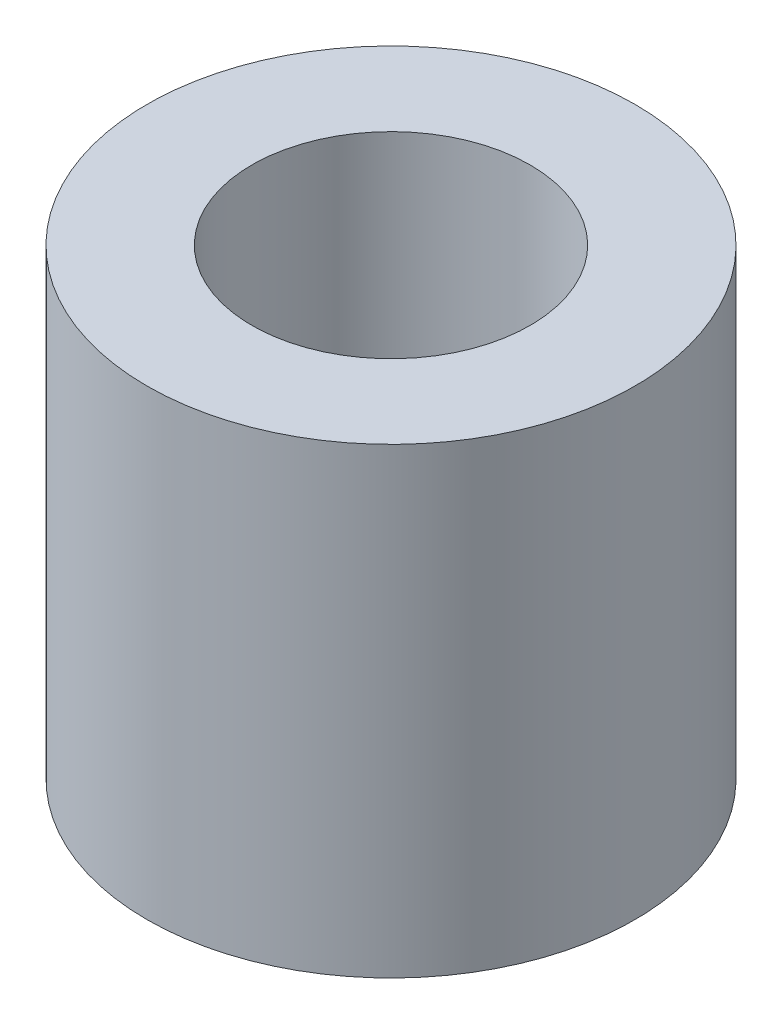
ISO-10303-21;
HEADER;
FILE_DESCRIPTION(('STEP AP214'),'2;1');
FILE_NAME('part.step','',(''),(''),'','','');
FILE_SCHEMA(('AUTOMOTIVE_DESIGN { 1 0 10303 214 1 1 1 1 }'));
ENDSEC;
DATA;
#1=APPLICATION_CONTEXT('core data for automotive mechanical design processes');
#2=APPLICATION_PROTOCOL_DEFINITION('international standard','automotive_design',2000,#1);
#3=PRODUCT_CONTEXT('',#1,'mechanical');
#4=PRODUCT('Part','Part','',(#3));
#5=PRODUCT_RELATED_PRODUCT_CATEGORY('part','',(#4));
#6=PRODUCT_DEFINITION_FORMATION('','',#4);
#7=PRODUCT_DEFINITION_CONTEXT('part definition',#1,'design');
#8=PRODUCT_DEFINITION('design','',#6,#7);
#9=PRODUCT_DEFINITION_SHAPE('','',#8);
#10=(LENGTH_UNIT() NAMED_UNIT(*) SI_UNIT(.MILLI.,.METRE.));
#11=(NAMED_UNIT(*) PLANE_ANGLE_UNIT() SI_UNIT($,.RADIAN.));
#12=(NAMED_UNIT(*) SI_UNIT($,.STERADIAN.) SOLID_ANGLE_UNIT());
#13=UNCERTAINTY_MEASURE_WITH_UNIT(LENGTH_MEASURE(1.E-05),#10,'distance_accuracy_value','');
#14=(GEOMETRIC_REPRESENTATION_CONTEXT(3) GLOBAL_UNCERTAINTY_ASSIGNED_CONTEXT((#13)) GLOBAL_UNIT_ASSIGNED_CONTEXT((#10,
#11,#12)) REPRESENTATION_CONTEXT('',''));
#15=CARTESIAN_POINT('',(0.,0.,0.));
#16=DIRECTION('',(0.,0.,1.));
#17=DIRECTION('',(1.,0.,0.));
#18=AXIS2_PLACEMENT_3D('',#15,#16,#17);
#19=CARTESIAN_POINT('',(0.,20.6,0.));
#20=DIRECTION('',(0.,1.,0.));
#21=DIRECTION('',(0.,0.,1.));
#22=AXIS2_PLACEMENT_3D('',#19,#20,#21);
#23=PLANE('',#22);
#24=CARTESIAN_POINT('',(0.,20.6,0.));
#25=DIRECTION('',(0.,1.,0.));
#26=DIRECTION('',(0.,0.,1.));
#27=AXIS2_PLACEMENT_3D('',#24,#25,#26);
#28=CIRCLE('',#27,21.75);
#29=CARTESIAN_POINT('',(0.,20.6,-21.75));
#30=VERTEX_POINT('',#29);
#31=EDGE_CURVE('E10',#30,#30,#28,.T.);
#32=ORIENTED_EDGE('',*,*,#31,.T.);
#33=EDGE_LOOP('',(#32));
#34=FACE_BOUND('',#33,.T.);
#35=CARTESIAN_POINT('',(0.,20.6,0.));
#36=DIRECTION('',(0.,1.,0.));
#37=DIRECTION('',(0.,0.,1.));
#38=AXIS2_PLACEMENT_3D('',#35,#36,#37);
#39=CIRCLE('',#38,12.4);
#40=CARTESIAN_POINT('',(0.,20.6,-12.4));
#41=VERTEX_POINT('',#40);
#42=EDGE_CURVE('E42',#41,#41,#39,.T.);
#43=ORIENTED_EDGE('',*,*,#42,.F.);
#44=EDGE_LOOP('',(#43));
#45=FACE_BOUND('',#44,.T.);
#46=ADVANCED_FACE('F31',(#34,#45),#23,.T.);
#47=CARTESIAN_POINT('',(0.,-20.6,0.));
#48=DIRECTION('',(0.,1.,0.));
#49=DIRECTION('',(0.,0.,1.));
#50=AXIS2_PLACEMENT_3D('',#47,#48,#49);
#51=PLANE('',#50);
#52=CARTESIAN_POINT('',(0.,-20.6,0.));
#53=DIRECTION('',(0.,1.,0.));
#54=DIRECTION('',(0.,0.,1.));
#55=AXIS2_PLACEMENT_3D('',#52,#53,#54);
#56=CIRCLE('',#55,21.75);
#57=CARTESIAN_POINT('',(0.,-20.6,-21.75));
#58=VERTEX_POINT('',#57);
#59=EDGE_CURVE('E35',#58,#58,#56,.T.);
#60=ORIENTED_EDGE('',*,*,#59,.F.);
#61=EDGE_LOOP('',(#60));
#62=FACE_BOUND('',#61,.T.);
#63=CARTESIAN_POINT('',(0.,-20.6,0.));
#64=DIRECTION('',(0.,1.,0.));
#65=DIRECTION('',(0.,0.,1.));
#66=AXIS2_PLACEMENT_3D('',#63,#64,#65);
#67=CIRCLE('',#66,12.4);
#68=CARTESIAN_POINT('',(0.,-20.6,-12.4));
#69=VERTEX_POINT('',#68);
#70=EDGE_CURVE('E44',#69,#69,#67,.T.);
#71=ORIENTED_EDGE('',*,*,#70,.T.);
#72=EDGE_LOOP('',(#71));
#73=FACE_BOUND('',#72,.T.);
#74=ADVANCED_FACE('F54',(#62,#73),#51,.F.);
#75=CARTESIAN_POINT('',(0.,20.6,0.));
#76=DIRECTION('',(0.,-1.,0.));
#77=DIRECTION('',(0.,0.,-1.));
#78=AXIS2_PLACEMENT_3D('',#75,#76,#77);
#79=CYLINDRICAL_SURFACE('',#78,21.75);
#80=CARTESIAN_POINT('',(0.,20.6,-21.75));
#81=CARTESIAN_POINT('',(0.,20.1708333333333,-21.75));
#82=CARTESIAN_POINT('',(0.,19.7416666666667,-21.75));
#83=CARTESIAN_POINT('',(0.,18.8833333333333,-21.75));
#84=CARTESIAN_POINT('',(0.,18.4541666666667,-21.75));
#85=CARTESIAN_POINT('',(0.,17.5958333333333,-21.75));
#86=CARTESIAN_POINT('',(0.,17.1666666666667,-21.75));
#87=CARTESIAN_POINT('',(0.,16.3083333333333,-21.75));
#88=CARTESIAN_POINT('',(0.,15.8791666666667,-21.75));
#89=CARTESIAN_POINT('',(0.,15.0208333333333,-21.75));
#90=CARTESIAN_POINT('',(0.,14.5916666666667,-21.75));
#91=CARTESIAN_POINT('',(0.,13.7333333333333,-21.75));
#92=CARTESIAN_POINT('',(0.,13.3041666666667,-21.75));
#93=CARTESIAN_POINT('',(0.,12.4458333333333,-21.75));
#94=CARTESIAN_POINT('',(0.,12.0166666666667,-21.75));
#95=CARTESIAN_POINT('',(0.,11.1583333333333,-21.75));
#96=CARTESIAN_POINT('',(0.,10.7291666666667,-21.75));
#97=CARTESIAN_POINT('',(0.,9.87083333333333,-21.75));
#98=CARTESIAN_POINT('',(0.,9.44166666666666,-21.75));
#99=CARTESIAN_POINT('',(0.,8.58333333333333,-21.75));
#100=CARTESIAN_POINT('',(0.,8.15416666666666,-21.75));
#101=CARTESIAN_POINT('',(0.,7.29583333333333,-21.75));
#102=CARTESIAN_POINT('',(0.,6.86666666666666,-21.75));
#103=CARTESIAN_POINT('',(0.,6.00833333333333,-21.75));
#104=CARTESIAN_POINT('',(0.,5.57916666666666,-21.75));
#105=CARTESIAN_POINT('',(0.,4.72083333333333,-21.75));
#106=CARTESIAN_POINT('',(0.,4.29166666666666,-21.75));
#107=CARTESIAN_POINT('',(0.,3.43333333333333,-21.75));
#108=CARTESIAN_POINT('',(0.,3.00416666666666,-21.75));
#109=CARTESIAN_POINT('',(0.,2.14583333333333,-21.75));
#110=CARTESIAN_POINT('',(0.,1.71666666666666,-21.75));
#111=CARTESIAN_POINT('',(0.,0.858333333333327,-21.75));
#112=CARTESIAN_POINT('',(0.,0.42916666666666,-21.75));
#113=CARTESIAN_POINT('',(0.,-0.429166666666674,-21.75));
#114=CARTESIAN_POINT('',(0.,-0.858333333333341,-21.75));
#115=CARTESIAN_POINT('',(0.,-1.71666666666667,-21.75));
#116=CARTESIAN_POINT('',(0.,-2.14583333333334,-21.75));
#117=CARTESIAN_POINT('',(0.,-3.00416666666667,-21.75));
#118=CARTESIAN_POINT('',(0.,-3.43333333333334,-21.75));
#119=CARTESIAN_POINT('',(0.,-4.29166666666667,-21.75));
#120=CARTESIAN_POINT('',(0.,-4.72083333333334,-21.75));
#121=CARTESIAN_POINT('',(0.,-5.57916666666668,-21.75));
#122=CARTESIAN_POINT('',(0.,-6.00833333333334,-21.75));
#123=CARTESIAN_POINT('',(0.,-6.86666666666668,-21.75));
#124=CARTESIAN_POINT('',(0.,-7.29583333333334,-21.75));
#125=CARTESIAN_POINT('',(0.,-8.15416666666668,-21.75));
#126=CARTESIAN_POINT('',(0.,-8.58333333333334,-21.75));
#127=CARTESIAN_POINT('',(0.,-9.44166666666668,-21.75));
#128=CARTESIAN_POINT('',(0.,-9.87083333333334,-21.75));
#129=CARTESIAN_POINT('',(0.,-10.7291666666667,-21.75));
#130=CARTESIAN_POINT('',(0.,-11.1583333333333,-21.75));
#131=CARTESIAN_POINT('',(0.,-12.0166666666667,-21.75));
#132=CARTESIAN_POINT('',(0.,-12.4458333333333,-21.75));
#133=CARTESIAN_POINT('',(0.,-13.3041666666667,-21.75));
#134=CARTESIAN_POINT('',(0.,-13.7333333333333,-21.75));
#135=CARTESIAN_POINT('',(0.,-14.5916666666667,-21.75));
#136=CARTESIAN_POINT('',(0.,-15.0208333333333,-21.75));
#137=CARTESIAN_POINT('',(0.,-15.8791666666667,-21.75));
#138=CARTESIAN_POINT('',(0.,-16.3083333333333,-21.75));
#139=CARTESIAN_POINT('',(0.,-17.1666666666667,-21.75));
#140=CARTESIAN_POINT('',(0.,-17.5958333333333,-21.75));
#141=CARTESIAN_POINT('',(0.,-18.4541666666667,-21.75));
#142=CARTESIAN_POINT('',(0.,-18.8833333333333,-21.75));
#143=CARTESIAN_POINT('',(0.,-19.7416666666667,-21.75));
#144=CARTESIAN_POINT('',(0.,-20.1708333333333,-21.75));
#145=CARTESIAN_POINT('',(0.,-20.6,-21.75));
#146=B_SPLINE_CURVE_WITH_KNOTS('',3,(#80,#81,#82,#83,#84,#85,#86,#87,#88,#89,#90,#91,#92,#93,
#94,#95,#96,#97,#98,#99,#100,#101,#102,#103,#104,#105,#106,#107,#108,#109,#110,#111,#112,#113,
#114,#115,#116,#117,#118,#119,#120,#121,#122,#123,#124,#125,#126,#127,#128,#129,#130,#131,#132,
#133,#134,#135,#136,#137,#138,#139,#140,#141,#142,#143,#144,#145),.UNSPECIFIED.,.F.,.F.,(4,2,2,
2,2,2,2,2,2,2,2,2,2,2,2,2,2,2,2,2,2,2,2,2,2,2,2,2,2,2,2,2,4),(0.,1.2875,2.575,3.8625,5.15,
6.4375,7.725,9.0125,10.3,11.5875,12.875,14.1625,15.45,16.7375,18.025,19.3125,20.6,21.8875,
23.175,24.4625,25.75,27.0375,28.325,29.6125,30.9,32.1875,33.475,34.7625,36.05,37.3375,38.625,
39.9125,41.2),.UNSPECIFIED.);
#147=EDGE_CURVE('BSEAM33',#30,#58,#146,.T.);
#148=ORIENTED_EDGE('',*,*,#31,.F.);
#149=ORIENTED_EDGE('',*,*,#59,.T.);
#150=ORIENTED_EDGE('',*,*,#147,.T.);
#151=ORIENTED_EDGE('',*,*,#147,.F.);
#152=EDGE_LOOP('',(#148,#150,#149,#151));
#153=FACE_BOUND('',#152,.T.);
#154=ADVANCED_FACE('F33',(#153),#79,.T.);
#155=CARTESIAN_POINT('',(0.,20.6,0.));
#156=DIRECTION('',(0.,-1.,0.));
#157=DIRECTION('',(0.,0.,-1.));
#158=AXIS2_PLACEMENT_3D('',#155,#156,#157);
#159=CYLINDRICAL_SURFACE('',#158,12.4);
#160=CARTESIAN_POINT('',(0.,20.6,-12.4));
#161=CARTESIAN_POINT('',(0.,20.1708333333333,-12.4));
#162=CARTESIAN_POINT('',(0.,19.7416666666667,-12.4));
#163=CARTESIAN_POINT('',(0.,18.8833333333333,-12.4));
#164=CARTESIAN_POINT('',(0.,18.4541666666667,-12.4));
#165=CARTESIAN_POINT('',(0.,17.5958333333333,-12.4));
#166=CARTESIAN_POINT('',(0.,17.1666666666667,-12.4));
#167=CARTESIAN_POINT('',(0.,16.3083333333333,-12.4));
#168=CARTESIAN_POINT('',(0.,15.8791666666667,-12.4));
#169=CARTESIAN_POINT('',(0.,15.0208333333333,-12.4));
#170=CARTESIAN_POINT('',(0.,14.5916666666667,-12.4));
#171=CARTESIAN_POINT('',(0.,13.7333333333333,-12.4));
#172=CARTESIAN_POINT('',(0.,13.3041666666667,-12.4));
#173=CARTESIAN_POINT('',(0.,12.4458333333333,-12.4));
#174=CARTESIAN_POINT('',(0.,12.0166666666667,-12.4));
#175=CARTESIAN_POINT('',(0.,11.1583333333333,-12.4));
#176=CARTESIAN_POINT('',(0.,10.7291666666667,-12.4));
#177=CARTESIAN_POINT('',(0.,9.87083333333333,-12.4));
#178=CARTESIAN_POINT('',(0.,9.44166666666666,-12.4));
#179=CARTESIAN_POINT('',(0.,8.58333333333333,-12.4));
#180=CARTESIAN_POINT('',(0.,8.15416666666666,-12.4));
#181=CARTESIAN_POINT('',(0.,7.29583333333333,-12.4));
#182=CARTESIAN_POINT('',(0.,6.86666666666666,-12.4));
#183=CARTESIAN_POINT('',(0.,6.00833333333333,-12.4));
#184=CARTESIAN_POINT('',(0.,5.57916666666666,-12.4));
#185=CARTESIAN_POINT('',(0.,4.72083333333333,-12.4));
#186=CARTESIAN_POINT('',(0.,4.29166666666666,-12.4));
#187=CARTESIAN_POINT('',(0.,3.43333333333333,-12.4));
#188=CARTESIAN_POINT('',(0.,3.00416666666666,-12.4));
#189=CARTESIAN_POINT('',(0.,2.14583333333333,-12.4));
#190=CARTESIAN_POINT('',(0.,1.71666666666666,-12.4));
#191=CARTESIAN_POINT('',(0.,0.85833333333333,-12.4));
#192=CARTESIAN_POINT('',(0.,0.429166666666663,-12.4));
#193=CARTESIAN_POINT('',(0.,-0.42916666666667,-12.4));
#194=CARTESIAN_POINT('',(0.,-0.858333333333337,-12.4));
#195=CARTESIAN_POINT('',(0.,-1.71666666666667,-12.4));
#196=CARTESIAN_POINT('',(0.,-2.14583333333334,-12.4));
#197=CARTESIAN_POINT('',(0.,-3.00416666666667,-12.4));
#198=CARTESIAN_POINT('',(0.,-3.43333333333334,-12.4));
#199=CARTESIAN_POINT('',(0.,-4.29166666666667,-12.4));
#200=CARTESIAN_POINT('',(0.,-4.72083333333334,-12.4));
#201=CARTESIAN_POINT('',(0.,-5.57916666666667,-12.4));
#202=CARTESIAN_POINT('',(0.,-6.00833333333334,-12.4));
#203=CARTESIAN_POINT('',(0.,-6.86666666666667,-12.4));
#204=CARTESIAN_POINT('',(0.,-7.29583333333334,-12.4));
#205=CARTESIAN_POINT('',(0.,-8.15416666666667,-12.4));
#206=CARTESIAN_POINT('',(0.,-8.58333333333334,-12.4));
#207=CARTESIAN_POINT('',(0.,-9.44166666666667,-12.4));
#208=CARTESIAN_POINT('',(0.,-9.87083333333334,-12.4));
#209=CARTESIAN_POINT('',(0.,-10.7291666666667,-12.4));
#210=CARTESIAN_POINT('',(0.,-11.1583333333333,-12.4));
#211=CARTESIAN_POINT('',(0.,-12.0166666666667,-12.4));
#212=CARTESIAN_POINT('',(0.,-12.4458333333333,-12.4));
#213=CARTESIAN_POINT('',(0.,-13.3041666666667,-12.4));
#214=CARTESIAN_POINT('',(0.,-13.7333333333333,-12.4));
#215=CARTESIAN_POINT('',(0.,-14.5916666666667,-12.4));
#216=CARTESIAN_POINT('',(0.,-15.0208333333333,-12.4));
#217=CARTESIAN_POINT('',(0.,-15.8791666666667,-12.4));
#218=CARTESIAN_POINT('',(0.,-16.3083333333333,-12.4));
#219=CARTESIAN_POINT('',(0.,-17.1666666666667,-12.4));
#220=CARTESIAN_POINT('',(0.,-17.5958333333333,-12.4));
#221=CARTESIAN_POINT('',(0.,-18.4541666666667,-12.4));
#222=CARTESIAN_POINT('',(0.,-18.8833333333333,-12.4));
#223=CARTESIAN_POINT('',(0.,-19.7416666666667,-12.4));
#224=CARTESIAN_POINT('',(0.,-20.1708333333333,-12.4));
#225=CARTESIAN_POINT('',(0.,-20.6,-12.4));
#226=B_SPLINE_CURVE_WITH_KNOTS('',3,(#160,#161,#162,#163,#164,#165,#166,#167,#168,#169,#170,
#171,#172,#173,#174,#175,#176,#177,#178,#179,#180,#181,#182,#183,#184,#185,#186,#187,#188,#189,
#190,#191,#192,#193,#194,#195,#196,#197,#198,#199,#200,#201,#202,#203,#204,#205,#206,#207,#208,
#209,#210,#211,#212,#213,#214,#215,#216,#217,#218,#219,#220,#221,#222,#223,#224,#225),
.UNSPECIFIED.,.F.,.F.,(4,2,2,2,2,2,2,2,2,2,2,2,2,2,2,2,2,2,2,2,2,2,2,2,2,2,2,2,2,2,2,2,4),(0.,
1.2875,2.575,3.8625,5.15,6.4375,7.725,9.0125,10.3,11.5875,12.875,14.1625,15.45,16.7375,18.025,
19.3125,20.6,21.8875,23.175,24.4625,25.75,27.0375,28.325,29.6125,30.9,32.1875,33.475,34.7625,
36.05,37.3375,38.625,39.9125,41.2),.UNSPECIFIED.);
#227=EDGE_CURVE('BSEAM50',#41,#69,#226,.T.);
#228=ORIENTED_EDGE('',*,*,#42,.T.);
#229=ORIENTED_EDGE('',*,*,#70,.F.);
#230=ORIENTED_EDGE('',*,*,#227,.T.);
#231=ORIENTED_EDGE('',*,*,#227,.F.);
#232=EDGE_LOOP('',(#228,#230,#229,#231));
#233=FACE_BOUND('',#232,.T.);
#234=ADVANCED_FACE('F50',(#233),#159,.F.);
#235=CLOSED_SHELL('',(#46,#74,#154,#234));
#236=MANIFOLD_SOLID_BREP('B2',#235);
#237=ADVANCED_BREP_SHAPE_REPRESENTATION('',(#18,#236),#14);
#238=SHAPE_DEFINITION_REPRESENTATION(#9,#237);
ENDSEC;
END-ISO-10303-21;
